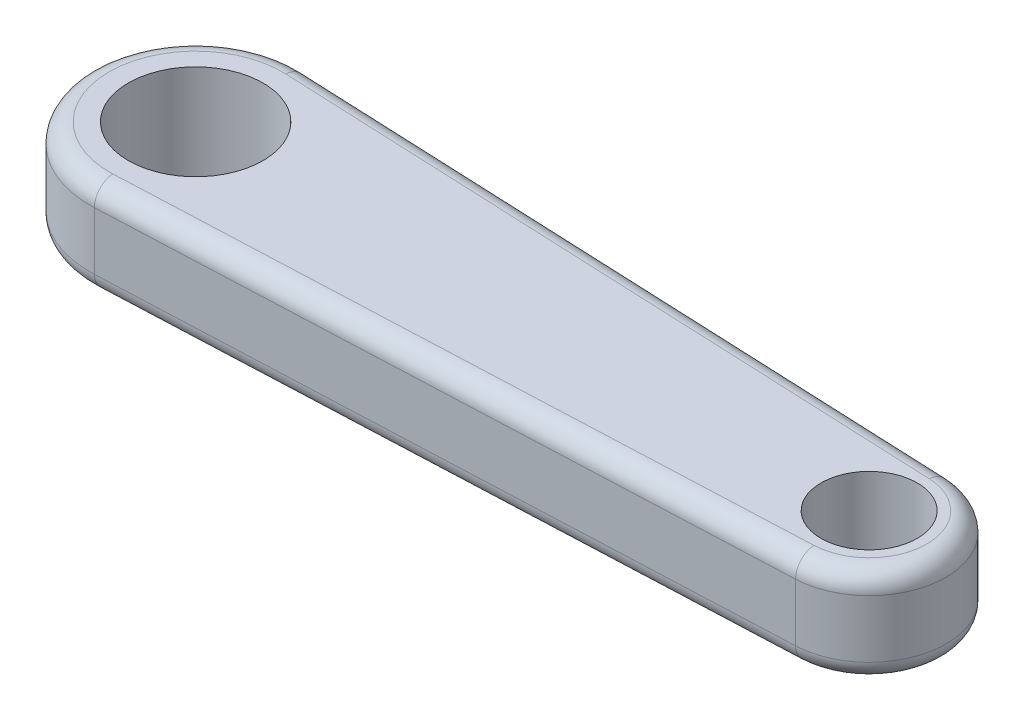
ISO-10303-21;
HEADER;
FILE_DESCRIPTION(('STEP AP214'),'2;1');
FILE_NAME('part.step','',(''),(''),'','','');
FILE_SCHEMA(('AUTOMOTIVE_DESIGN { 1 0 10303 214 1 1 1 1 }'));
ENDSEC;
DATA;
#1=APPLICATION_CONTEXT('core data for automotive mechanical design processes');
#2=APPLICATION_PROTOCOL_DEFINITION('international standard','automotive_design',2000,#1);
#3=PRODUCT_CONTEXT('',#1,'mechanical');
#4=PRODUCT('Part','Part','',(#3));
#5=PRODUCT_RELATED_PRODUCT_CATEGORY('part','',(#4));
#6=PRODUCT_DEFINITION_FORMATION('','',#4);
#7=PRODUCT_DEFINITION_CONTEXT('part definition',#1,'design');
#8=PRODUCT_DEFINITION('design','',#6,#7);
#9=PRODUCT_DEFINITION_SHAPE('','',#8);
#10=(LENGTH_UNIT() NAMED_UNIT(*) SI_UNIT(.MILLI.,.METRE.));
#11=(NAMED_UNIT(*) PLANE_ANGLE_UNIT() SI_UNIT($,.RADIAN.));
#12=(NAMED_UNIT(*) SI_UNIT($,.STERADIAN.) SOLID_ANGLE_UNIT());
#13=UNCERTAINTY_MEASURE_WITH_UNIT(LENGTH_MEASURE(1.E-05),#10,'distance_accuracy_value','');
#14=(GEOMETRIC_REPRESENTATION_CONTEXT(3) GLOBAL_UNCERTAINTY_ASSIGNED_CONTEXT((#13)) GLOBAL_UNIT_ASSIGNED_CONTEXT((#10,
#11,#12)) REPRESENTATION_CONTEXT('',''));
#15=CARTESIAN_POINT('',(0.,0.,0.));
#16=DIRECTION('',(0.,0.,1.));
#17=DIRECTION('',(1.,0.,0.));
#18=AXIS2_PLACEMENT_3D('',#15,#16,#17);
#19=CARTESIAN_POINT('',(-150.,50.,0.));
#20=DIRECTION('',(0.,1.,0.));
#21=DIRECTION('',(0.,0.,1.));
#22=AXIS2_PLACEMENT_3D('',#19,#20,#21);
#23=PLANE('',#22);
#24=DIRECTION('',(0.999081210566049,0.,-0.0428571428571429));
#25=VECTOR('',#24,1.);
#26=CARTESIAN_POINT('',(201.285714285714,50.,29.9724363169815));
#27=LINE('',#26,#25);
#28=CARTESIAN_POINT('',(-148.071428571429,50.,44.9586544754722));
#29=VERTEX_POINT('',#28);
#30=CARTESIAN_POINT('',(201.285714285714,50.,29.9724363169815));
#31=VERTEX_POINT('',#30);
#32=EDGE_CURVE('E54',#29,#31,#27,.T.);
#33=ORIENTED_EDGE('',*,*,#32,.T.);
#34=CARTESIAN_POINT('',(200.,50.,0.));
#35=DIRECTION('',(0.,1.,0.));
#36=DIRECTION('',(0.,0.,1.));
#37=AXIS2_PLACEMENT_3D('',#34,#35,#36);
#38=CIRCLE('',#37,30.);
#39=CARTESIAN_POINT('',(201.285714285714,50.,-29.9724363169815));
#40=VERTEX_POINT('',#39);
#41=EDGE_CURVE('E160',#31,#40,#38,.T.);
#42=ORIENTED_EDGE('',*,*,#41,.T.);
#43=DIRECTION('',(-0.999081210566049,0.,-0.0428571428571429));
#44=VECTOR('',#43,1.);
#45=CARTESIAN_POINT('',(-148.071428571429,50.,-44.9586544754722));
#46=LINE('',#45,#44);
#47=CARTESIAN_POINT('',(-148.071428571429,50.,-44.9586544754722));
#48=VERTEX_POINT('',#47);
#49=EDGE_CURVE('E156',#40,#48,#46,.T.);
#50=ORIENTED_EDGE('',*,*,#49,.T.);
#51=CARTESIAN_POINT('',(-150.,50.,0.));
#52=DIRECTION('',(0.,1.,0.));
#53=DIRECTION('',(0.,0.,1.));
#54=AXIS2_PLACEMENT_3D('',#51,#52,#53);
#55=CIRCLE('',#54,45.);
#56=EDGE_CURVE('E59',#48,#29,#55,.T.);
#57=ORIENTED_EDGE('',*,*,#56,.T.);
#58=EDGE_LOOP('',(#33,#42,#50,#57));
#59=FACE_BOUND('',#58,.T.);
#60=CARTESIAN_POINT('',(-150.,50.,0.));
#61=DIRECTION('',(0.,1.,0.));
#62=DIRECTION('',(0.,0.,1.));
#63=AXIS2_PLACEMENT_3D('',#60,#61,#62);
#64=CIRCLE('',#63,35.);
#65=CARTESIAN_POINT('',(-150.,50.,35.));
#66=VERTEX_POINT('',#65);
#67=EDGE_CURVE('E122',#66,#66,#64,.T.);
#68=ORIENTED_EDGE('',*,*,#67,.F.);
#69=EDGE_LOOP('',(#68));
#70=FACE_BOUND('',#69,.T.);
#71=CARTESIAN_POINT('',(200.,50.,0.));
#72=DIRECTION('',(0.,1.,0.));
#73=DIRECTION('',(0.,0.,1.));
#74=AXIS2_PLACEMENT_3D('',#71,#72,#73);
#75=CIRCLE('',#74,25.);
#76=CARTESIAN_POINT('',(200.,50.,25.));
#77=VERTEX_POINT('',#76);
#78=EDGE_CURVE('E195',#77,#77,#75,.T.);
#79=ORIENTED_EDGE('',*,*,#78,.F.);
#80=EDGE_LOOP('',(#79));
#81=FACE_BOUND('',#80,.T.);
#82=ADVANCED_FACE('F37',(#59,#70,#81),#23,.T.);
#83=CARTESIAN_POINT('',(-150.,0.,0.));
#84=DIRECTION('',(0.,1.,0.));
#85=DIRECTION('',(0.,0.,1.));
#86=AXIS2_PLACEMENT_3D('',#83,#84,#85);
#87=PLANE('',#86);
#88=CARTESIAN_POINT('',(-150.,0.,0.));
#89=DIRECTION('',(0.,1.,0.));
#90=DIRECTION('',(0.,0.,1.));
#91=AXIS2_PLACEMENT_3D('',#88,#89,#90);
#92=CIRCLE('',#91,45.);
#93=CARTESIAN_POINT('',(-148.071428571429,0.,44.9586544754722));
#94=VERTEX_POINT('',#93);
#95=CARTESIAN_POINT('',(-148.071428571429,0.,-44.9586544754722));
#96=VERTEX_POINT('',#95);
#97=EDGE_CURVE('E133',#94,#96,#92,.F.);
#98=ORIENTED_EDGE('',*,*,#97,.T.);
#99=DIRECTION('',(-0.999081210566049,0.,-0.0428571428571429));
#100=VECTOR('',#99,1.);
#101=CARTESIAN_POINT('',(-148.071428571429,0.,-44.9586544754722));
#102=LINE('',#101,#100);
#103=CARTESIAN_POINT('',(201.285714285714,0.,-29.9724363169815));
#104=VERTEX_POINT('',#103);
#105=EDGE_CURVE('E144',#96,#104,#102,.F.);
#106=ORIENTED_EDGE('',*,*,#105,.T.);
#107=CARTESIAN_POINT('',(200.,0.,0.));
#108=DIRECTION('',(0.,1.,0.));
#109=DIRECTION('',(0.,0.,1.));
#110=AXIS2_PLACEMENT_3D('',#107,#108,#109);
#111=CIRCLE('',#110,30.);
#112=CARTESIAN_POINT('',(201.285714285714,0.,29.9724363169815));
#113=VERTEX_POINT('',#112);
#114=EDGE_CURVE('E142',#104,#113,#111,.F.);
#115=ORIENTED_EDGE('',*,*,#114,.T.);
#116=DIRECTION('',(0.999081210566049,0.,-0.0428571428571429));
#117=VECTOR('',#116,1.);
#118=CARTESIAN_POINT('',(-148.071428571429,0.,44.9586544754722));
#119=LINE('',#118,#117);
#120=EDGE_CURVE('E140',#113,#94,#119,.F.);
#121=ORIENTED_EDGE('',*,*,#120,.T.);
#122=EDGE_LOOP('',(#98,#106,#115,#121));
#123=FACE_BOUND('',#122,.T.);
#124=CARTESIAN_POINT('',(-150.,0.,0.));
#125=DIRECTION('',(0.,1.,0.));
#126=DIRECTION('',(0.,0.,1.));
#127=AXIS2_PLACEMENT_3D('',#124,#125,#126);
#128=CIRCLE('',#127,35.);
#129=CARTESIAN_POINT('',(-150.,0.,35.));
#130=VERTEX_POINT('',#129);
#131=EDGE_CURVE('E192',#130,#130,#128,.T.);
#132=ORIENTED_EDGE('',*,*,#131,.T.);
#133=EDGE_LOOP('',(#132));
#134=FACE_BOUND('',#133,.T.);
#135=CARTESIAN_POINT('',(200.,0.,0.));
#136=DIRECTION('',(0.,1.,0.));
#137=DIRECTION('',(0.,0.,1.));
#138=AXIS2_PLACEMENT_3D('',#135,#136,#137);
#139=CIRCLE('',#138,25.);
#140=CARTESIAN_POINT('',(200.,0.,25.));
#141=VERTEX_POINT('',#140);
#142=EDGE_CURVE('E173',#141,#141,#139,.T.);
#143=ORIENTED_EDGE('',*,*,#142,.T.);
#144=EDGE_LOOP('',(#143));
#145=FACE_BOUND('',#144,.T.);
#146=ADVANCED_FACE('F207',(#123,#134,#145),#87,.F.);
#147=CARTESIAN_POINT('',(-150.,50.,0.));
#148=DIRECTION('',(0.,-1.,0.));
#149=DIRECTION('',(0.,0.,-1.));
#150=AXIS2_PLACEMENT_3D('',#147,#148,#149);
#151=CYLINDRICAL_SURFACE('',#150,55.);
#152=DIRECTION('',(0.,-1.,0.));
#153=VECTOR('',#152,1.);
#154=CARTESIAN_POINT('',(-147.642857142857,50.,54.9494665811327));
#155=LINE('',#154,#153);
#156=CARTESIAN_POINT('',(-147.642857142857,40.,54.9494665811327));
#157=VERTEX_POINT('',#156);
#158=CARTESIAN_POINT('',(-147.642857142857,10.,54.9494665811327));
#159=VERTEX_POINT('',#158);
#160=EDGE_CURVE('E108',#157,#159,#155,.T.);
#161=ORIENTED_EDGE('',*,*,#160,.F.);
#162=CARTESIAN_POINT('',(-150.,40.,0.));
#163=DIRECTION('',(0.,1.,0.));
#164=DIRECTION('',(0.,0.,1.));
#165=AXIS2_PLACEMENT_3D('',#162,#163,#164);
#166=CIRCLE('',#165,55.);
#167=CARTESIAN_POINT('',(-147.642857142857,40.,-54.9494665811327));
#168=VERTEX_POINT('',#167);
#169=EDGE_CURVE('E11',#157,#168,#166,.F.);
#170=ORIENTED_EDGE('',*,*,#169,.T.);
#171=DIRECTION('',(0.,-1.,0.));
#172=VECTOR('',#171,1.);
#173=CARTESIAN_POINT('',(-147.642857142857,50.,-54.9494665811327));
#174=LINE('',#173,#172);
#175=CARTESIAN_POINT('',(-147.642857142857,10.,-54.9494665811327));
#176=VERTEX_POINT('',#175);
#177=EDGE_CURVE('E106',#168,#176,#174,.T.);
#178=ORIENTED_EDGE('',*,*,#177,.T.);
#179=CARTESIAN_POINT('',(-150.,10.,0.));
#180=DIRECTION('',(0.,1.,0.));
#181=DIRECTION('',(0.,0.,1.));
#182=AXIS2_PLACEMENT_3D('',#179,#180,#181);
#183=CIRCLE('',#182,55.);
#184=EDGE_CURVE('E46',#176,#159,#183,.T.);
#185=ORIENTED_EDGE('',*,*,#184,.T.);
#186=EDGE_LOOP('',(#161,#170,#178,#185));
#187=FACE_BOUND('',#186,.T.);
#188=ADVANCED_FACE('F105',(#187),#151,.T.);
#189=CARTESIAN_POINT('',(-147.642857142857,50.,54.9494665811327));
#190=DIRECTION('',(-0.0428571428571429,0.,-0.999081210566049));
#191=DIRECTION('',(-0.999081210566049,0.,0.0428571428571429));
#192=AXIS2_PLACEMENT_3D('',#189,#190,#191);
#193=PLANE('',#192);
#194=ORIENTED_EDGE('',*,*,#160,.T.);
#195=DIRECTION('',(0.999081210566049,0.,-0.0428571428571429));
#196=VECTOR('',#195,1.);
#197=CARTESIAN_POINT('',(-147.642857142857,10.,54.9494665811327));
#198=LINE('',#197,#196);
#199=CARTESIAN_POINT('',(201.714285714286,10.,39.963248422642));
#200=VERTEX_POINT('',#199);
#201=EDGE_CURVE('E154',#159,#200,#198,.T.);
#202=ORIENTED_EDGE('',*,*,#201,.T.);
#203=DIRECTION('',(0.,-1.,0.));
#204=VECTOR('',#203,1.);
#205=CARTESIAN_POINT('',(201.714285714286,50.,39.963248422642));
#206=LINE('',#205,#204);
#207=CARTESIAN_POINT('',(201.714285714286,40.,39.963248422642));
#208=VERTEX_POINT('',#207);
#209=EDGE_CURVE('E135',#208,#200,#206,.T.);
#210=ORIENTED_EDGE('',*,*,#209,.F.);
#211=DIRECTION('',(0.999081210566049,0.,-0.0428571428571429));
#212=VECTOR('',#211,1.);
#213=CARTESIAN_POINT('',(-147.642857142857,40.,54.9494665811327));
#214=LINE('',#213,#212);
#215=EDGE_CURVE('E152',#208,#157,#214,.F.);
#216=ORIENTED_EDGE('',*,*,#215,.T.);
#217=EDGE_LOOP('',(#194,#202,#210,#216));
#218=FACE_BOUND('',#217,.T.);
#219=ADVANCED_FACE('F188',(#218),#193,.F.);
#220=CARTESIAN_POINT('',(200.,50.,0.));
#221=DIRECTION('',(0.,-1.,0.));
#222=DIRECTION('',(0.,0.,-1.));
#223=AXIS2_PLACEMENT_3D('',#220,#221,#222);
#224=CYLINDRICAL_SURFACE('',#223,40.);
#225=ORIENTED_EDGE('',*,*,#209,.T.);
#226=CARTESIAN_POINT('',(200.,10.,0.));
#227=DIRECTION('',(0.,1.,0.));
#228=DIRECTION('',(0.,0.,1.));
#229=AXIS2_PLACEMENT_3D('',#226,#227,#228);
#230=CIRCLE('',#229,40.);
#231=CARTESIAN_POINT('',(201.714285714286,10.,-39.963248422642));
#232=VERTEX_POINT('',#231);
#233=EDGE_CURVE('E150',#200,#232,#230,.T.);
#234=ORIENTED_EDGE('',*,*,#233,.T.);
#235=DIRECTION('',(0.,-1.,0.));
#236=VECTOR('',#235,1.);
#237=CARTESIAN_POINT('',(201.714285714286,50.,-39.963248422642));
#238=LINE('',#237,#236);
#239=CARTESIAN_POINT('',(201.714285714286,40.,-39.963248422642));
#240=VERTEX_POINT('',#239);
#241=EDGE_CURVE('E121',#240,#232,#238,.T.);
#242=ORIENTED_EDGE('',*,*,#241,.F.);
#243=CARTESIAN_POINT('',(200.,40.,0.));
#244=DIRECTION('',(0.,1.,0.));
#245=DIRECTION('',(0.,0.,1.));
#246=AXIS2_PLACEMENT_3D('',#243,#244,#245);
#247=CIRCLE('',#246,40.);
#248=EDGE_CURVE('E147',#240,#208,#247,.F.);
#249=ORIENTED_EDGE('',*,*,#248,.T.);
#250=EDGE_LOOP('',(#225,#234,#242,#249));
#251=FACE_BOUND('',#250,.T.);
#252=ADVANCED_FACE('F186',(#251),#224,.T.);
#253=CARTESIAN_POINT('',(-147.642857142857,50.,-54.9494665811327));
#254=DIRECTION('',(-0.0428571428571429,0.,0.999081210566049));
#255=DIRECTION('',(0.999081210566049,0.,0.0428571428571429));
#256=AXIS2_PLACEMENT_3D('',#253,#254,#255);
#257=PLANE('',#256);
#258=ORIENTED_EDGE('',*,*,#241,.T.);
#259=DIRECTION('',(-0.999081210566049,0.,-0.0428571428571429));
#260=VECTOR('',#259,1.);
#261=CARTESIAN_POINT('',(-147.642857142857,10.,-54.9494665811327));
#262=LINE('',#261,#260);
#263=EDGE_CURVE('E120',#232,#176,#262,.T.);
#264=ORIENTED_EDGE('',*,*,#263,.T.);
#265=ORIENTED_EDGE('',*,*,#177,.F.);
#266=DIRECTION('',(-0.999081210566049,0.,-0.0428571428571429));
#267=VECTOR('',#266,1.);
#268=CARTESIAN_POINT('',(201.714285714286,40.,-39.963248422642));
#269=LINE('',#268,#267);
#270=EDGE_CURVE('E117',#168,#240,#269,.F.);
#271=ORIENTED_EDGE('',*,*,#270,.T.);
#272=EDGE_LOOP('',(#258,#264,#265,#271));
#273=FACE_BOUND('',#272,.T.);
#274=ADVANCED_FACE('F115',(#273),#257,.F.);
#275=CARTESIAN_POINT('',(-150.,50.,0.));
#276=DIRECTION('',(0.,-1.,0.));
#277=DIRECTION('',(0.,0.,-1.));
#278=AXIS2_PLACEMENT_3D('',#275,#276,#277);
#279=CYLINDRICAL_SURFACE('',#278,35.);
#280=ORIENTED_EDGE('',*,*,#67,.T.);
#281=EDGE_LOOP('',(#280));
#282=FACE_BOUND('',#281,.T.);
#283=ORIENTED_EDGE('',*,*,#131,.F.);
#284=EDGE_LOOP('',(#283));
#285=FACE_BOUND('',#284,.T.);
#286=ADVANCED_FACE('F216',(#282,#285),#279,.F.);
#287=CARTESIAN_POINT('',(200.,50.,0.));
#288=DIRECTION('',(0.,-1.,0.));
#289=DIRECTION('',(0.,0.,-1.));
#290=AXIS2_PLACEMENT_3D('',#287,#288,#289);
#291=CYLINDRICAL_SURFACE('',#290,25.);
#292=ORIENTED_EDGE('',*,*,#78,.T.);
#293=EDGE_LOOP('',(#292));
#294=FACE_BOUND('',#293,.T.);
#295=ORIENTED_EDGE('',*,*,#142,.F.);
#296=EDGE_LOOP('',(#295));
#297=FACE_BOUND('',#296,.T.);
#298=ADVANCED_FACE('F203',(#294,#297),#291,.F.);
#299=CARTESIAN_POINT('',(-148.071428571429,10.,44.9586544754722));
#300=DIRECTION('',(0.999081210566049,0.,-0.0428571428571429));
#301=DIRECTION('',(-0.0428571428571429,0.,-0.999081210566049));
#302=AXIS2_PLACEMENT_3D('',#299,#300,#301);
#303=CYLINDRICAL_SURFACE('',#302,10.);
#304=CARTESIAN_POINT('',(-148.071428571429,10.,44.9586544754722));
#305=DIRECTION('',(-0.999081210566049,0.,0.0428571428571417));
#306=DIRECTION('',(0.0428571428571417,0.,0.999081210566049));
#307=AXIS2_PLACEMENT_3D('',#304,#305,#306);
#308=CIRCLE('',#307,10.);
#309=EDGE_CURVE('E167',#94,#159,#308,.T.);
#310=ORIENTED_EDGE('',*,*,#309,.F.);
#311=ORIENTED_EDGE('',*,*,#120,.F.);
#312=CARTESIAN_POINT('',(201.285714285714,10.,29.9724363169815));
#313=DIRECTION('',(0.999081210566049,0.,-0.0428571428571417));
#314=DIRECTION('',(-0.0428571428571417,0.,-0.999081210566049));
#315=AXIS2_PLACEMENT_3D('',#312,#313,#314);
#316=CIRCLE('',#315,10.);
#317=EDGE_CURVE('E170',#200,#113,#316,.T.);
#318=ORIENTED_EDGE('',*,*,#317,.F.);
#319=ORIENTED_EDGE('',*,*,#201,.F.);
#320=EDGE_LOOP('',(#310,#311,#318,#319));
#321=FACE_BOUND('',#320,.T.);
#322=ADVANCED_FACE('F238',(#321),#303,.T.);
#323=CARTESIAN_POINT('',(200.,10.,0.));
#324=DIRECTION('',(0.,1.,0.));
#325=DIRECTION('',(0.,0.,1.));
#326=AXIS2_PLACEMENT_3D('',#323,#324,#325);
#327=TOROIDAL_SURFACE('',#326,30.,10.);
#328=ORIENTED_EDGE('',*,*,#317,.T.);
#329=ORIENTED_EDGE('',*,*,#114,.F.);
#330=CARTESIAN_POINT('',(201.285714285714,10.,-29.9724363169815));
#331=DIRECTION('',(-0.999081210566049,0.,-0.0428571428571417));
#332=DIRECTION('',(-0.0428571428571417,0.,0.999081210566049));
#333=AXIS2_PLACEMENT_3D('',#330,#331,#332);
#334=CIRCLE('',#333,10.);
#335=EDGE_CURVE('E165',#232,#104,#334,.T.);
#336=ORIENTED_EDGE('',*,*,#335,.F.);
#337=ORIENTED_EDGE('',*,*,#233,.F.);
#338=EDGE_LOOP('',(#328,#329,#336,#337));
#339=FACE_BOUND('',#338,.T.);
#340=ADVANCED_FACE('F234',(#339),#327,.T.);
#341=CARTESIAN_POINT('',(-150.,10.,0.));
#342=DIRECTION('',(0.,1.,0.));
#343=DIRECTION('',(0.,0.,1.));
#344=AXIS2_PLACEMENT_3D('',#341,#342,#343);
#345=TOROIDAL_SURFACE('',#344,45.,10.);
#346=ORIENTED_EDGE('',*,*,#309,.T.);
#347=ORIENTED_EDGE('',*,*,#184,.F.);
#348=CARTESIAN_POINT('',(-148.071428571429,10.,-44.9586544754722));
#349=DIRECTION('',(0.999081210566049,0.,0.0428571428571417));
#350=DIRECTION('',(0.0428571428571417,0.,-0.999081210566049));
#351=AXIS2_PLACEMENT_3D('',#348,#349,#350);
#352=CIRCLE('',#351,10.);
#353=EDGE_CURVE('E163',#96,#176,#352,.T.);
#354=ORIENTED_EDGE('',*,*,#353,.F.);
#355=ORIENTED_EDGE('',*,*,#97,.F.);
#356=EDGE_LOOP('',(#346,#347,#354,#355));
#357=FACE_BOUND('',#356,.T.);
#358=ADVANCED_FACE('F230',(#357),#345,.T.);
#359=CARTESIAN_POINT('',(-148.071428571429,10.,-44.9586544754722));
#360=DIRECTION('',(-0.999081210566049,0.,-0.0428571428571429));
#361=DIRECTION('',(-0.0428571428571429,0.,0.999081210566049));
#362=AXIS2_PLACEMENT_3D('',#359,#360,#361);
#363=CYLINDRICAL_SURFACE('',#362,10.);
#364=ORIENTED_EDGE('',*,*,#335,.T.);
#365=ORIENTED_EDGE('',*,*,#105,.F.);
#366=ORIENTED_EDGE('',*,*,#353,.T.);
#367=ORIENTED_EDGE('',*,*,#263,.F.);
#368=EDGE_LOOP('',(#364,#365,#366,#367));
#369=FACE_BOUND('',#368,.T.);
#370=ADVANCED_FACE('F227',(#369),#363,.T.);
#371=CARTESIAN_POINT('',(-150.,40.,0.));
#372=DIRECTION('',(0.,1.,0.));
#373=DIRECTION('',(0.,0.,1.));
#374=AXIS2_PLACEMENT_3D('',#371,#372,#373);
#375=TOROIDAL_SURFACE('',#374,45.,10.);
#376=CARTESIAN_POINT('',(-148.071428571429,40.,-44.9586544754722));
#377=DIRECTION('',(0.999081210566049,0.,0.0428571428571417));
#378=DIRECTION('',(0.0428571428571417,0.,-0.999081210566049));
#379=AXIS2_PLACEMENT_3D('',#376,#377,#378);
#380=CIRCLE('',#379,10.);
#381=EDGE_CURVE('E125',#168,#48,#380,.T.);
#382=ORIENTED_EDGE('',*,*,#381,.F.);
#383=ORIENTED_EDGE('',*,*,#169,.F.);
#384=CARTESIAN_POINT('',(-148.071428571429,40.,44.9586544754722));
#385=DIRECTION('',(0.999081210566049,0.,-0.0428571428571417));
#386=DIRECTION('',(-0.0428571428571417,0.,-0.999081210566049));
#387=AXIS2_PLACEMENT_3D('',#384,#385,#386);
#388=CIRCLE('',#387,10.);
#389=EDGE_CURVE('E41',#29,#157,#388,.T.);
#390=ORIENTED_EDGE('',*,*,#389,.F.);
#391=ORIENTED_EDGE('',*,*,#56,.F.);
#392=EDGE_LOOP('',(#382,#383,#390,#391));
#393=FACE_BOUND('',#392,.T.);
#394=ADVANCED_FACE('F39',(#393),#375,.T.);
#395=CARTESIAN_POINT('',(-148.071428571429,40.,44.9586544754722));
#396=DIRECTION('',(-0.999081210566049,0.,0.0428571428571429));
#397=DIRECTION('',(0.0428571428571429,0.,0.999081210566049));
#398=AXIS2_PLACEMENT_3D('',#395,#396,#397);
#399=CYLINDRICAL_SURFACE('',#398,10.);
#400=ORIENTED_EDGE('',*,*,#389,.T.);
#401=ORIENTED_EDGE('',*,*,#215,.F.);
#402=CARTESIAN_POINT('',(201.285714285714,40.,29.9724363169815));
#403=DIRECTION('',(0.999081210566049,0.,-0.0428571428571417));
#404=DIRECTION('',(-0.0428571428571417,0.,-0.999081210566049));
#405=AXIS2_PLACEMENT_3D('',#402,#403,#404);
#406=CIRCLE('',#405,10.);
#407=EDGE_CURVE('E128',#31,#208,#406,.T.);
#408=ORIENTED_EDGE('',*,*,#407,.F.);
#409=ORIENTED_EDGE('',*,*,#32,.F.);
#410=EDGE_LOOP('',(#400,#401,#408,#409));
#411=FACE_BOUND('',#410,.T.);
#412=ADVANCED_FACE('F181',(#411),#399,.T.);
#413=CARTESIAN_POINT('',(-148.071428571429,40.,-44.9586544754722));
#414=DIRECTION('',(0.999081210566049,0.,0.0428571428571429));
#415=DIRECTION('',(0.0428571428571429,0.,-0.999081210566049));
#416=AXIS2_PLACEMENT_3D('',#413,#414,#415);
#417=CYLINDRICAL_SURFACE('',#416,10.);
#418=ORIENTED_EDGE('',*,*,#381,.T.);
#419=ORIENTED_EDGE('',*,*,#49,.F.);
#420=CARTESIAN_POINT('',(201.285714285714,40.,-29.9724363169815));
#421=DIRECTION('',(0.999081210566049,0.,0.0428571428571417));
#422=DIRECTION('',(0.0428571428571417,0.,-0.999081210566049));
#423=AXIS2_PLACEMENT_3D('',#420,#421,#422);
#424=CIRCLE('',#423,10.);
#425=EDGE_CURVE('E131',#240,#40,#424,.T.);
#426=ORIENTED_EDGE('',*,*,#425,.F.);
#427=ORIENTED_EDGE('',*,*,#270,.F.);
#428=EDGE_LOOP('',(#418,#419,#426,#427));
#429=FACE_BOUND('',#428,.T.);
#430=ADVANCED_FACE('F130',(#429),#417,.T.);
#431=CARTESIAN_POINT('',(200.,40.,0.));
#432=DIRECTION('',(0.,1.,0.));
#433=DIRECTION('',(0.,0.,1.));
#434=AXIS2_PLACEMENT_3D('',#431,#432,#433);
#435=TOROIDAL_SURFACE('',#434,30.,10.);
#436=ORIENTED_EDGE('',*,*,#407,.T.);
#437=ORIENTED_EDGE('',*,*,#248,.F.);
#438=ORIENTED_EDGE('',*,*,#425,.T.);
#439=ORIENTED_EDGE('',*,*,#41,.F.);
#440=EDGE_LOOP('',(#436,#437,#438,#439));
#441=FACE_BOUND('',#440,.T.);
#442=ADVANCED_FACE('F179',(#441),#435,.T.);
#443=CLOSED_SHELL('',(#82,#146,#188,#219,#252,#274,#286,#298,#322,#340,#358,#370,#394,#412,#430,#442));
#444=MANIFOLD_SOLID_BREP('B2',#443);
#445=ADVANCED_BREP_SHAPE_REPRESENTATION('',(#18,#444),#14);
#446=SHAPE_DEFINITION_REPRESENTATION(#9,#445);
ENDSEC;
END-ISO-10303-21;
